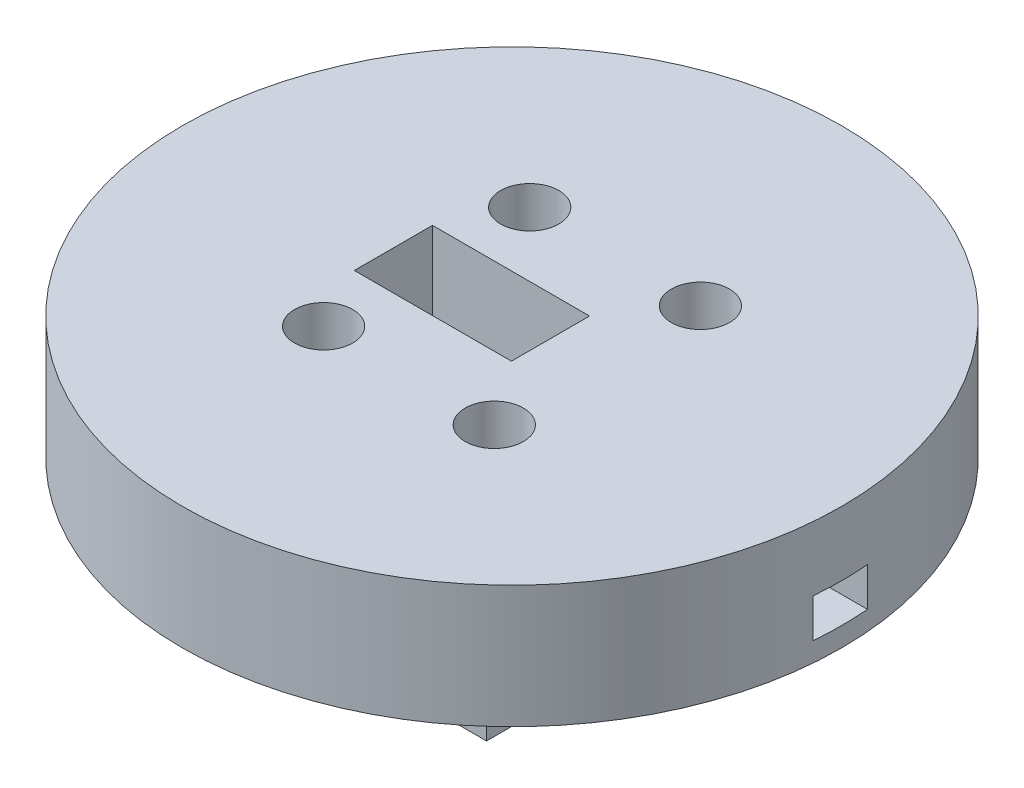
ISO-10303-21;
HEADER;
FILE_DESCRIPTION(('STEP AP214'),'2;1');
FILE_NAME('part.step','',(''),(''),'','','');
FILE_SCHEMA(('AUTOMOTIVE_DESIGN { 1 0 10303 214 1 1 1 1 }'));
ENDSEC;
DATA;
#1=APPLICATION_CONTEXT('core data for automotive mechanical design processes');
#2=APPLICATION_PROTOCOL_DEFINITION('international standard','automotive_design',2000,#1);
#3=PRODUCT_CONTEXT('',#1,'mechanical');
#4=PRODUCT('Part','Part','',(#3));
#5=PRODUCT_RELATED_PRODUCT_CATEGORY('part','',(#4));
#6=PRODUCT_DEFINITION_FORMATION('','',#4);
#7=PRODUCT_DEFINITION_CONTEXT('part definition',#1,'design');
#8=PRODUCT_DEFINITION('design','',#6,#7);
#9=PRODUCT_DEFINITION_SHAPE('','',#8);
#10=(LENGTH_UNIT() NAMED_UNIT(*) SI_UNIT(.MILLI.,.METRE.));
#11=(NAMED_UNIT(*) PLANE_ANGLE_UNIT() SI_UNIT($,.RADIAN.));
#12=(NAMED_UNIT(*) SI_UNIT($,.STERADIAN.) SOLID_ANGLE_UNIT());
#13=UNCERTAINTY_MEASURE_WITH_UNIT(LENGTH_MEASURE(1.E-05),#10,'distance_accuracy_value','');
#14=(GEOMETRIC_REPRESENTATION_CONTEXT(3) GLOBAL_UNCERTAINTY_ASSIGNED_CONTEXT((#13)) GLOBAL_UNIT_ASSIGNED_CONTEXT((#10,
#11,#12)) REPRESENTATION_CONTEXT('',''));
#15=CARTESIAN_POINT('',(0.,0.,0.));
#16=DIRECTION('',(0.,0.,1.));
#17=DIRECTION('',(1.,0.,0.));
#18=AXIS2_PLACEMENT_3D('',#15,#16,#17);
#19=CARTESIAN_POINT('',(-22.,-25.6066017177982,-26.57));
#20=DIRECTION('',(0.,1.,0.));
#21=DIRECTION('',(-1.,0.,0.));
#22=AXIS2_PLACEMENT_3D('',#19,#20,#21);
#23=CYLINDRICAL_SURFACE('',#22,3.74999999999999);
#24=CARTESIAN_POINT('',(-22.,-15.,-26.57));
#25=DIRECTION('',(0.,1.,0.));
#26=DIRECTION('',(-1.,0.,0.));
#27=AXIS2_PLACEMENT_3D('',#24,#25,#26);
#28=CIRCLE('',#27,3.74999999999999);
#29=CARTESIAN_POINT('',(-25.75,-15.,-26.57));
#30=VERTEX_POINT('',#29);
#31=EDGE_CURVE('E283',#30,#30,#28,.F.);
#32=ORIENTED_EDGE('',*,*,#31,.T.);
#33=EDGE_LOOP('',(#32));
#34=FACE_BOUND('',#33,.T.);
#35=CARTESIAN_POINT('',(-22.,-5.,-26.57));
#36=DIRECTION('',(0.,1.,0.));
#37=DIRECTION('',(-1.,0.,0.));
#38=AXIS2_PLACEMENT_3D('',#35,#36,#37);
#39=CIRCLE('',#38,3.74999999999999);
#40=CARTESIAN_POINT('',(-25.75,-5.,-26.57));
#41=VERTEX_POINT('',#40);
#42=EDGE_CURVE('E270',#41,#41,#39,.F.);
#43=ORIENTED_EDGE('',*,*,#42,.F.);
#44=EDGE_LOOP('',(#43));
#45=FACE_BOUND('',#44,.T.);
#46=ADVANCED_FACE('F32',(#34,#45),#23,.F.);
#47=CARTESIAN_POINT('',(22.,-25.6066017177982,26.57));
#48=DIRECTION('',(0.,1.,0.));
#49=DIRECTION('',(-1.,0.,0.));
#50=AXIS2_PLACEMENT_3D('',#47,#48,#49);
#51=CYLINDRICAL_SURFACE('',#50,3.75);
#52=CARTESIAN_POINT('',(22.,-15.,26.57));
#53=DIRECTION('',(0.,1.,0.));
#54=DIRECTION('',(-1.,0.,0.));
#55=AXIS2_PLACEMENT_3D('',#52,#53,#54);
#56=CIRCLE('',#55,3.75);
#57=CARTESIAN_POINT('',(18.25,-15.,26.57));
#58=VERTEX_POINT('',#57);
#59=EDGE_CURVE('E292',#58,#58,#56,.F.);
#60=ORIENTED_EDGE('',*,*,#59,.T.);
#61=EDGE_LOOP('',(#60));
#62=FACE_BOUND('',#61,.T.);
#63=CARTESIAN_POINT('',(22.,-5.,26.57));
#64=DIRECTION('',(0.,1.,0.));
#65=DIRECTION('',(-1.,0.,0.));
#66=AXIS2_PLACEMENT_3D('',#63,#64,#65);
#67=CIRCLE('',#66,3.75);
#68=CARTESIAN_POINT('',(18.25,-5.,26.57));
#69=VERTEX_POINT('',#68);
#70=EDGE_CURVE('E282',#69,#69,#67,.F.);
#71=ORIENTED_EDGE('',*,*,#70,.F.);
#72=EDGE_LOOP('',(#71));
#73=FACE_BOUND('',#72,.T.);
#74=ADVANCED_FACE('F508',(#62,#73),#51,.F.);
#75=CARTESIAN_POINT('',(30.,-15.,36.57));
#76=DIRECTION('',(0.,1.,0.));
#77=DIRECTION('',(-1.,0.,0.));
#78=AXIS2_PLACEMENT_3D('',#75,#76,#77);
#79=PLANE('',#78);
#80=ORIENTED_EDGE('',*,*,#59,.F.);
#81=EDGE_LOOP('',(#80));
#82=FACE_BOUND('',#81,.T.);
#83=DIRECTION('',(1.,0.,0.));
#84=VECTOR('',#83,1.);
#85=CARTESIAN_POINT('',(30.,-15.,36.57));
#86=LINE('',#85,#84);
#87=CARTESIAN_POINT('',(15.0942378864668,-15.,36.57));
#88=VERTEX_POINT('',#87);
#89=CARTESIAN_POINT('',(30.,-15.,36.57));
#90=VERTEX_POINT('',#89);
#91=EDGE_CURVE('E351',#88,#90,#86,.T.);
#92=ORIENTED_EDGE('',*,*,#91,.F.);
#93=DIRECTION('',(0.,0.,1.));
#94=VECTOR('',#93,1.);
#95=CARTESIAN_POINT('',(15.0942378864668,-15.,-73.3871114360294));
#96=LINE('',#95,#94);
#97=CARTESIAN_POINT('',(15.0942378864668,-15.,6.00000000000001));
#98=VERTEX_POINT('',#97);
#99=EDGE_CURVE('E321',#98,#88,#96,.T.);
#100=ORIENTED_EDGE('',*,*,#99,.F.);
#101=DIRECTION('',(1.,0.,0.));
#102=VECTOR('',#101,1.);
#103=CARTESIAN_POINT('',(-43.4164078649987,-15.,6.));
#104=LINE('',#103,#102);
#105=CARTESIAN_POINT('',(30.,-15.,6.));
#106=VERTEX_POINT('',#105);
#107=EDGE_CURVE('E342',#98,#106,#104,.T.);
#108=ORIENTED_EDGE('',*,*,#107,.T.);
#109=DIRECTION('',(0.,0.,-1.));
#110=VECTOR('',#109,1.);
#111=CARTESIAN_POINT('',(30.,-15.,36.57));
#112=LINE('',#111,#110);
#113=EDGE_CURVE('E367',#90,#106,#112,.T.);
#114=ORIENTED_EDGE('',*,*,#113,.F.);
#115=EDGE_LOOP('',(#92,#100,#108,#114));
#116=FACE_BOUND('',#115,.T.);
#117=ADVANCED_FACE('F463',(#82,#116),#79,.F.);
#118=CARTESIAN_POINT('',(22.,-15.,-26.57));
#119=DIRECTION('',(0.,1.,0.));
#120=DIRECTION('',(-1.,0.,0.));
#121=AXIS2_PLACEMENT_3D('',#118,#119,#120);
#122=CIRCLE('',#121,3.75);
#123=CARTESIAN_POINT('',(18.25,-15.,-26.57));
#124=VERTEX_POINT('',#123);
#125=EDGE_CURVE('E286',#124,#124,#122,.F.);
#126=ORIENTED_EDGE('',*,*,#125,.F.);
#127=EDGE_LOOP('',(#126));
#128=FACE_BOUND('',#127,.T.);
#129=DIRECTION('',(1.,0.,0.));
#130=VECTOR('',#129,1.);
#131=CARTESIAN_POINT('',(-43.4164078649987,-15.,-6.));
#132=LINE('',#131,#130);
#133=CARTESIAN_POINT('',(15.0942378864668,-15.,-6.00000000000001));
#134=VERTEX_POINT('',#133);
#135=CARTESIAN_POINT('',(30.,-15.,-6.));
#136=VERTEX_POINT('',#135);
#137=EDGE_CURVE('E345',#134,#136,#132,.T.);
#138=ORIENTED_EDGE('',*,*,#137,.F.);
#139=CARTESIAN_POINT('',(15.0942378864668,-15.,-36.57));
#140=VERTEX_POINT('',#139);
#141=EDGE_CURVE('E299',#140,#134,#96,.T.);
#142=ORIENTED_EDGE('',*,*,#141,.F.);
#143=DIRECTION('',(1.,0.,0.));
#144=VECTOR('',#143,1.);
#145=CARTESIAN_POINT('',(30.,-15.,-36.57));
#146=LINE('',#145,#144);
#147=CARTESIAN_POINT('',(30.,-15.,-36.57));
#148=VERTEX_POINT('',#147);
#149=EDGE_CURVE('E361',#140,#148,#146,.T.);
#150=ORIENTED_EDGE('',*,*,#149,.T.);
#151=EDGE_CURVE('E359',#136,#148,#112,.T.);
#152=ORIENTED_EDGE('',*,*,#151,.F.);
#153=EDGE_LOOP('',(#138,#142,#150,#152));
#154=FACE_BOUND('',#153,.T.);
#155=ADVANCED_FACE('F850',(#128,#154),#79,.F.);
#156=CARTESIAN_POINT('',(-43.4164078649987,-15.,0.));
#157=DIRECTION('',(1.,0.,0.));
#158=DIRECTION('',(0.,0.,-1.));
#159=AXIS2_PLACEMENT_3D('',#156,#157,#158);
#160=CYLINDRICAL_SURFACE('',#159,6.);
#161=CARTESIAN_POINT('',(15.0942378864668,-15.,0.));
#162=DIRECTION('',(0.965925826289069,0.258819045102518,0.));
#163=DIRECTION('',(0.258819045102518,-0.965925826289069,0.));
#164=AXIS2_PLACEMENT_3D('',#161,#162,#163);
#165=ELLIPSE('',#164,6.21165708246049,6.);
#166=EDGE_CURVE('E376',#134,#98,#165,.T.);
#167=ORIENTED_EDGE('',*,*,#166,.F.);
#168=ORIENTED_EDGE('',*,*,#137,.T.);
#169=CARTESIAN_POINT('',(30.,-15.,0.));
#170=DIRECTION('',(1.,0.,0.));
#171=DIRECTION('',(0.,0.,-1.));
#172=AXIS2_PLACEMENT_3D('',#169,#170,#171);
#173=CIRCLE('',#172,6.);
#174=EDGE_CURVE('E334',#106,#136,#173,.F.);
#175=ORIENTED_EDGE('',*,*,#174,.F.);
#176=ORIENTED_EDGE('',*,*,#107,.F.);
#177=EDGE_LOOP('',(#167,#168,#175,#176));
#178=FACE_BOUND('',#177,.T.);
#179=ADVANCED_FACE('F467',(#178),#160,.F.);
#180=CARTESIAN_POINT('',(-30.,-15.,36.57));
#181=DIRECTION('',(1.,0.,0.));
#182=DIRECTION('',(0.,0.,-1.));
#183=AXIS2_PLACEMENT_3D('',#180,#181,#182);
#184=PLANE('',#183);
#185=DIRECTION('',(0.,-1.,0.));
#186=VECTOR('',#185,1.);
#187=CARTESIAN_POINT('',(-30.,-15.,36.57));
#188=LINE('',#187,#186);
#189=CARTESIAN_POINT('',(-30.,7.,36.57));
#190=VERTEX_POINT('',#189);
#191=CARTESIAN_POINT('',(-30.,-15.,36.57));
#192=VERTEX_POINT('',#191);
#193=EDGE_CURVE('E349',#190,#192,#188,.T.);
#194=ORIENTED_EDGE('',*,*,#193,.F.);
#195=DIRECTION('',(0.,0.,1.));
#196=VECTOR('',#195,1.);
#197=CARTESIAN_POINT('',(-30.,6.99999999999999,-36.57));
#198=LINE('',#197,#196);
#199=CARTESIAN_POINT('',(-30.,7.,-36.57));
#200=VERTEX_POINT('',#199);
#201=EDGE_CURVE('E11',#190,#200,#198,.F.);
#202=ORIENTED_EDGE('',*,*,#201,.T.);
#203=DIRECTION('',(0.,-1.,0.));
#204=VECTOR('',#203,1.);
#205=CARTESIAN_POINT('',(-30.,-15.,-36.57));
#206=LINE('',#205,#204);
#207=CARTESIAN_POINT('',(-30.,-15.,-36.57));
#208=VERTEX_POINT('',#207);
#209=EDGE_CURVE('E338',#200,#208,#206,.T.);
#210=ORIENTED_EDGE('',*,*,#209,.T.);
#211=DIRECTION('',(0.,0.,-1.));
#212=VECTOR('',#211,1.);
#213=CARTESIAN_POINT('',(-30.,-15.,36.57));
#214=LINE('',#213,#212);
#215=CARTESIAN_POINT('',(-30.,-15.,-6.));
#216=VERTEX_POINT('',#215);
#217=EDGE_CURVE('E370',#216,#208,#214,.T.);
#218=ORIENTED_EDGE('',*,*,#217,.F.);
#219=CARTESIAN_POINT('',(-30.,-15.,0.));
#220=DIRECTION('',(1.,0.,0.));
#221=DIRECTION('',(0.,0.,-1.));
#222=AXIS2_PLACEMENT_3D('',#219,#220,#221);
#223=CIRCLE('',#222,6.);
#224=CARTESIAN_POINT('',(-30.,-15.,6.));
#225=VERTEX_POINT('',#224);
#226=EDGE_CURVE('E335',#216,#225,#223,.T.);
#227=ORIENTED_EDGE('',*,*,#226,.T.);
#228=EDGE_CURVE('E371',#192,#225,#214,.T.);
#229=ORIENTED_EDGE('',*,*,#228,.F.);
#230=EDGE_LOOP('',(#194,#202,#210,#218,#227,#229));
#231=FACE_BOUND('',#230,.T.);
#232=ADVANCED_FACE('F427',(#231),#184,.F.);
#233=CARTESIAN_POINT('',(-22.,-15.,26.57));
#234=DIRECTION('',(0.,1.,0.));
#235=DIRECTION('',(-1.,0.,0.));
#236=AXIS2_PLACEMENT_3D('',#233,#234,#235);
#237=CIRCLE('',#236,3.75);
#238=CARTESIAN_POINT('',(-25.75,-15.,26.57));
#239=VERTEX_POINT('',#238);
#240=EDGE_CURVE('E289',#239,#239,#237,.F.);
#241=ORIENTED_EDGE('',*,*,#240,.F.);
#242=EDGE_LOOP('',(#241));
#243=FACE_BOUND('',#242,.T.);
#244=CARTESIAN_POINT('',(-15.0942378864669,-15.,6.));
#245=VERTEX_POINT('',#244);
#246=EDGE_CURVE('E346',#225,#245,#104,.T.);
#247=ORIENTED_EDGE('',*,*,#246,.T.);
#248=DIRECTION('',(0.,0.,1.));
#249=VECTOR('',#248,1.);
#250=CARTESIAN_POINT('',(-15.0942378864669,-15.,-73.3871114360294));
#251=LINE('',#250,#249);
#252=CARTESIAN_POINT('',(-15.0942378864669,-15.,36.57));
#253=VERTEX_POINT('',#252);
#254=EDGE_CURVE('E325',#245,#253,#251,.T.);
#255=ORIENTED_EDGE('',*,*,#254,.T.);
#256=EDGE_CURVE('E353',#192,#253,#86,.T.);
#257=ORIENTED_EDGE('',*,*,#256,.F.);
#258=ORIENTED_EDGE('',*,*,#228,.T.);
#259=EDGE_LOOP('',(#247,#255,#257,#258));
#260=FACE_BOUND('',#259,.T.);
#261=ADVANCED_FACE('F431',(#243,#260),#79,.F.);
#262=ORIENTED_EDGE('',*,*,#31,.F.);
#263=EDGE_LOOP('',(#262));
#264=FACE_BOUND('',#263,.T.);
#265=CARTESIAN_POINT('',(-15.0942378864669,-15.,-36.57));
#266=VERTEX_POINT('',#265);
#267=EDGE_CURVE('E362',#208,#266,#146,.T.);
#268=ORIENTED_EDGE('',*,*,#267,.T.);
#269=CARTESIAN_POINT('',(-15.0942378864669,-15.,-6.00000000000003));
#270=VERTEX_POINT('',#269);
#271=EDGE_CURVE('E322',#266,#270,#251,.T.);
#272=ORIENTED_EDGE('',*,*,#271,.T.);
#273=EDGE_CURVE('E339',#216,#270,#132,.T.);
#274=ORIENTED_EDGE('',*,*,#273,.F.);
#275=ORIENTED_EDGE('',*,*,#217,.T.);
#276=EDGE_LOOP('',(#268,#272,#274,#275));
#277=FACE_BOUND('',#276,.T.);
#278=ADVANCED_FACE('F549',(#264,#277),#79,.F.);
#279=CARTESIAN_POINT('',(30.,-15.,36.57));
#280=DIRECTION('',(-1.,0.,0.));
#281=DIRECTION('',(0.,0.,1.));
#282=AXIS2_PLACEMENT_3D('',#279,#280,#281);
#283=PLANE('',#282);
#284=DIRECTION('',(0.,1.,0.));
#285=VECTOR('',#284,1.);
#286=CARTESIAN_POINT('',(30.,-15.,-36.57));
#287=LINE('',#286,#285);
#288=CARTESIAN_POINT('',(30.,7.,-36.57));
#289=VERTEX_POINT('',#288);
#290=EDGE_CURVE('E352',#148,#289,#287,.T.);
#291=ORIENTED_EDGE('',*,*,#290,.T.);
#292=DIRECTION('',(0.,0.,1.));
#293=VECTOR('',#292,1.);
#294=CARTESIAN_POINT('',(30.,7.,36.57));
#295=LINE('',#294,#293);
#296=CARTESIAN_POINT('',(30.,7.,36.57));
#297=VERTEX_POINT('',#296);
#298=EDGE_CURVE('E398',#289,#297,#295,.T.);
#299=ORIENTED_EDGE('',*,*,#298,.T.);
#300=DIRECTION('',(0.,1.,0.));
#301=VECTOR('',#300,1.);
#302=CARTESIAN_POINT('',(30.,-15.,36.57));
#303=LINE('',#302,#301);
#304=EDGE_CURVE('E356',#90,#297,#303,.T.);
#305=ORIENTED_EDGE('',*,*,#304,.F.);
#306=ORIENTED_EDGE('',*,*,#113,.T.);
#307=ORIENTED_EDGE('',*,*,#174,.T.);
#308=ORIENTED_EDGE('',*,*,#151,.T.);
#309=EDGE_LOOP('',(#291,#299,#305,#306,#307,#308));
#310=FACE_BOUND('',#309,.T.);
#311=ADVANCED_FACE('F472',(#310),#283,.F.);
#312=CARTESIAN_POINT('',(0.,0.,36.57));
#313=DIRECTION('',(0.,0.,1.));
#314=DIRECTION('',(1.,0.,0.));
#315=AXIS2_PLACEMENT_3D('',#312,#313,#314);
#316=PLANE('',#315);
#317=ORIENTED_EDGE('',*,*,#304,.T.);
#318=DIRECTION('',(-1.,0.,0.));
#319=VECTOR('',#318,1.);
#320=CARTESIAN_POINT('',(0.,7.,36.57));
#321=LINE('',#320,#319);
#322=EDGE_CURVE('E41',#297,#190,#321,.T.);
#323=ORIENTED_EDGE('',*,*,#322,.T.);
#324=ORIENTED_EDGE('',*,*,#193,.T.);
#325=ORIENTED_EDGE('',*,*,#256,.T.);
#326=DIRECTION('',(-0.258819045102525,-0.965925826289067,0.));
#327=VECTOR('',#326,1.);
#328=CARTESIAN_POINT('',(-11.075,0.,36.57));
#329=LINE('',#328,#327);
#330=CARTESIAN_POINT('',(-11.075,0.,36.57));
#331=VERTEX_POINT('',#330);
#332=EDGE_CURVE('E317',#331,#253,#329,.T.);
#333=ORIENTED_EDGE('',*,*,#332,.F.);
#334=DIRECTION('',(-1.,0.,0.));
#335=VECTOR('',#334,1.);
#336=CARTESIAN_POINT('',(-6.075,0.,36.57));
#337=LINE('',#336,#335);
#338=CARTESIAN_POINT('',(-6.075,0.,36.57));
#339=VERTEX_POINT('',#338);
#340=EDGE_CURVE('E314',#339,#331,#337,.T.);
#341=ORIENTED_EDGE('',*,*,#340,.F.);
#342=CARTESIAN_POINT('',(0.,0.,36.57));
#343=DIRECTION('',(0.,0.,1.));
#344=DIRECTION('',(1.,0.,0.));
#345=AXIS2_PLACEMENT_3D('',#342,#343,#344);
#346=CIRCLE('',#345,6.075);
#347=CARTESIAN_POINT('',(6.075,0.,36.57));
#348=VERTEX_POINT('',#347);
#349=EDGE_CURVE('E311',#348,#339,#346,.T.);
#350=ORIENTED_EDGE('',*,*,#349,.F.);
#351=DIRECTION('',(-1.,0.,0.));
#352=VECTOR('',#351,1.);
#353=CARTESIAN_POINT('',(6.075,0.,36.57));
#354=LINE('',#353,#352);
#355=CARTESIAN_POINT('',(11.075,0.,36.57));
#356=VERTEX_POINT('',#355);
#357=EDGE_CURVE('E308',#356,#348,#354,.T.);
#358=ORIENTED_EDGE('',*,*,#357,.F.);
#359=DIRECTION('',(-0.258819045102518,0.965925826289069,0.));
#360=VECTOR('',#359,1.);
#361=CARTESIAN_POINT('',(11.075,0.,36.57));
#362=LINE('',#361,#360);
#363=EDGE_CURVE('E295',#88,#356,#362,.T.);
#364=ORIENTED_EDGE('',*,*,#363,.F.);
#365=ORIENTED_EDGE('',*,*,#91,.T.);
#366=EDGE_LOOP('',(#317,#323,#324,#325,#333,#341,#350,#358,#364,#365));
#367=FACE_BOUND('',#366,.T.);
#368=ADVANCED_FACE('F422',(#367),#316,.T.);
#369=CARTESIAN_POINT('',(0.,0.,-36.57));
#370=DIRECTION('',(0.,0.,1.));
#371=DIRECTION('',(1.,0.,0.));
#372=AXIS2_PLACEMENT_3D('',#369,#370,#371);
#373=PLANE('',#372);
#374=ORIENTED_EDGE('',*,*,#209,.F.);
#375=DIRECTION('',(-1.,0.,0.));
#376=VECTOR('',#375,1.);
#377=CARTESIAN_POINT('',(30.,7.,-36.57));
#378=LINE('',#377,#376);
#379=EDGE_CURVE('E395',#200,#289,#378,.F.);
#380=ORIENTED_EDGE('',*,*,#379,.T.);
#381=ORIENTED_EDGE('',*,*,#290,.F.);
#382=ORIENTED_EDGE('',*,*,#149,.F.);
#383=DIRECTION('',(0.258819045102518,-0.965925826289069,0.));
#384=VECTOR('',#383,1.);
#385=CARTESIAN_POINT('',(11.075,0.,-36.57));
#386=LINE('',#385,#384);
#387=CARTESIAN_POINT('',(11.075,0.,-36.57));
#388=VERTEX_POINT('',#387);
#389=EDGE_CURVE('E303',#388,#140,#386,.T.);
#390=ORIENTED_EDGE('',*,*,#389,.F.);
#391=DIRECTION('',(1.,0.,0.));
#392=VECTOR('',#391,1.);
#393=CARTESIAN_POINT('',(6.075,0.,-36.57));
#394=LINE('',#393,#392);
#395=CARTESIAN_POINT('',(6.075,0.,-36.57));
#396=VERTEX_POINT('',#395);
#397=EDGE_CURVE('E305',#396,#388,#394,.T.);
#398=ORIENTED_EDGE('',*,*,#397,.F.);
#399=CARTESIAN_POINT('',(0.,0.,-36.57));
#400=DIRECTION('',(0.,0.,1.));
#401=DIRECTION('',(1.,0.,0.));
#402=AXIS2_PLACEMENT_3D('',#399,#400,#401);
#403=CIRCLE('',#402,6.075);
#404=CARTESIAN_POINT('',(-6.075,0.,-36.57));
#405=VERTEX_POINT('',#404);
#406=EDGE_CURVE('E296',#405,#396,#403,.F.);
#407=ORIENTED_EDGE('',*,*,#406,.F.);
#408=DIRECTION('',(1.,0.,0.));
#409=VECTOR('',#408,1.);
#410=CARTESIAN_POINT('',(-6.075,0.,-36.57));
#411=LINE('',#410,#409);
#412=CARTESIAN_POINT('',(-11.075,0.,-36.57));
#413=VERTEX_POINT('',#412);
#414=EDGE_CURVE('E298',#413,#405,#411,.T.);
#415=ORIENTED_EDGE('',*,*,#414,.F.);
#416=DIRECTION('',(0.258819045102525,0.965925826289067,0.));
#417=VECTOR('',#416,1.);
#418=CARTESIAN_POINT('',(-11.075,0.,-36.57));
#419=LINE('',#418,#417);
#420=EDGE_CURVE('E301',#266,#413,#419,.T.);
#421=ORIENTED_EDGE('',*,*,#420,.F.);
#422=ORIENTED_EDGE('',*,*,#267,.F.);
#423=EDGE_LOOP('',(#374,#380,#381,#382,#390,#398,#407,#415,#421,#422));
#424=FACE_BOUND('',#423,.T.);
#425=ADVANCED_FACE('F476',(#424),#373,.F.);
#426=CARTESIAN_POINT('',(-15.0942378864669,-15.,0.));
#427=DIRECTION('',(-0.965925826289067,0.258819045102525,0.));
#428=DIRECTION('',(0.258819045102525,0.965925826289067,0.));
#429=AXIS2_PLACEMENT_3D('',#426,#427,#428);
#430=ELLIPSE('',#429,6.2116570824605,6.);
#431=EDGE_CURVE('E374',#245,#270,#430,.T.);
#432=ORIENTED_EDGE('',*,*,#431,.F.);
#433=ORIENTED_EDGE('',*,*,#246,.F.);
#434=ORIENTED_EDGE('',*,*,#226,.F.);
#435=ORIENTED_EDGE('',*,*,#273,.T.);
#436=EDGE_LOOP('',(#432,#433,#434,#435));
#437=FACE_BOUND('',#436,.T.);
#438=ADVANCED_FACE('F539',(#437),#160,.F.);
#439=CARTESIAN_POINT('',(11.075,0.,-73.3871114360294));
#440=DIRECTION('',(0.965925826289069,0.258819045102518,0.));
#441=DIRECTION('',(-0.258819045102518,0.965925826289069,0.));
#442=AXIS2_PLACEMENT_3D('',#439,#440,#441);
#443=PLANE('',#442);
#444=ORIENTED_EDGE('',*,*,#166,.T.);
#445=ORIENTED_EDGE('',*,*,#99,.T.);
#446=ORIENTED_EDGE('',*,*,#363,.T.);
#447=DIRECTION('',(0.,0.,1.));
#448=VECTOR('',#447,1.);
#449=CARTESIAN_POINT('',(11.075,0.,-73.3871114360294));
#450=LINE('',#449,#448);
#451=EDGE_CURVE('E319',#388,#356,#450,.T.);
#452=ORIENTED_EDGE('',*,*,#451,.F.);
#453=ORIENTED_EDGE('',*,*,#389,.T.);
#454=ORIENTED_EDGE('',*,*,#141,.T.);
#455=EDGE_LOOP('',(#444,#445,#446,#452,#453,#454));
#456=FACE_BOUND('',#455,.T.);
#457=ADVANCED_FACE('F458',(#456),#443,.F.);
#458=CARTESIAN_POINT('',(-11.075,0.,-73.3871114360294));
#459=DIRECTION('',(-0.965925826289067,0.258819045102525,0.));
#460=DIRECTION('',(-0.258819045102525,-0.965925826289067,0.));
#461=AXIS2_PLACEMENT_3D('',#458,#459,#460);
#462=PLANE('',#461);
#463=ORIENTED_EDGE('',*,*,#431,.T.);
#464=ORIENTED_EDGE('',*,*,#271,.F.);
#465=ORIENTED_EDGE('',*,*,#420,.T.);
#466=DIRECTION('',(0.,0.,1.));
#467=VECTOR('',#466,1.);
#468=CARTESIAN_POINT('',(-11.075,0.,-73.3871114360294));
#469=LINE('',#468,#467);
#470=EDGE_CURVE('E326',#413,#331,#469,.T.);
#471=ORIENTED_EDGE('',*,*,#470,.T.);
#472=ORIENTED_EDGE('',*,*,#332,.T.);
#473=ORIENTED_EDGE('',*,*,#254,.F.);
#474=EDGE_LOOP('',(#463,#464,#465,#471,#472,#473));
#475=FACE_BOUND('',#474,.T.);
#476=ADVANCED_FACE('F437',(#475),#462,.F.);
#477=CARTESIAN_POINT('',(-6.075,0.,-73.3871114360294));
#478=DIRECTION('',(0.,1.,0.));
#479=DIRECTION('',(-1.,0.,0.));
#480=AXIS2_PLACEMENT_3D('',#477,#478,#479);
#481=PLANE('',#480);
#482=ORIENTED_EDGE('',*,*,#414,.T.);
#483=DIRECTION('',(0.,0.,1.));
#484=VECTOR('',#483,1.);
#485=CARTESIAN_POINT('',(-6.075,0.,-73.3871114360294));
#486=LINE('',#485,#484);
#487=EDGE_CURVE('E328',#405,#339,#486,.T.);
#488=ORIENTED_EDGE('',*,*,#487,.T.);
#489=ORIENTED_EDGE('',*,*,#340,.T.);
#490=ORIENTED_EDGE('',*,*,#470,.F.);
#491=EDGE_LOOP('',(#482,#488,#489,#490));
#492=FACE_BOUND('',#491,.T.);
#493=ADVANCED_FACE('F443',(#492),#481,.F.);
#494=CARTESIAN_POINT('',(0.,0.,-73.3871114360294));
#495=DIRECTION('',(0.,0.,1.));
#496=DIRECTION('',(1.,0.,0.));
#497=AXIS2_PLACEMENT_3D('',#494,#495,#496);
#498=CYLINDRICAL_SURFACE('',#497,6.075);
#499=ORIENTED_EDGE('',*,*,#406,.T.);
#500=DIRECTION('',(0.,0.,1.));
#501=VECTOR('',#500,1.);
#502=CARTESIAN_POINT('',(6.075,0.,-73.3871114360294));
#503=LINE('',#502,#501);
#504=EDGE_CURVE('E330',#396,#348,#503,.T.);
#505=ORIENTED_EDGE('',*,*,#504,.T.);
#506=ORIENTED_EDGE('',*,*,#349,.T.);
#507=ORIENTED_EDGE('',*,*,#487,.F.);
#508=EDGE_LOOP('',(#499,#505,#506,#507));
#509=FACE_BOUND('',#508,.T.);
#510=ADVANCED_FACE('F447',(#509),#498,.F.);
#511=CARTESIAN_POINT('',(6.075,0.,-73.3871114360294));
#512=DIRECTION('',(0.,1.,0.));
#513=DIRECTION('',(0.,0.,1.));
#514=AXIS2_PLACEMENT_3D('',#511,#512,#513);
#515=PLANE('',#514);
#516=ORIENTED_EDGE('',*,*,#397,.T.);
#517=ORIENTED_EDGE('',*,*,#451,.T.);
#518=ORIENTED_EDGE('',*,*,#357,.T.);
#519=ORIENTED_EDGE('',*,*,#504,.F.);
#520=EDGE_LOOP('',(#516,#517,#518,#519));
#521=FACE_BOUND('',#520,.T.);
#522=ADVANCED_FACE('F453',(#521),#515,.F.);
#523=CARTESIAN_POINT('',(-22.,-25.6066017177982,26.57));
#524=DIRECTION('',(0.,1.,0.));
#525=DIRECTION('',(-1.,0.,0.));
#526=AXIS2_PLACEMENT_3D('',#523,#524,#525);
#527=CYLINDRICAL_SURFACE('',#526,3.75);
#528=CARTESIAN_POINT('',(-22.,-5.,26.57));
#529=DIRECTION('',(0.,-1.,0.));
#530=DIRECTION('',(1.,0.,0.));
#531=AXIS2_PLACEMENT_3D('',#528,#529,#530);
#532=CIRCLE('',#531,3.75);
#533=CARTESIAN_POINT('',(-18.25,-5.,26.57));
#534=VERTEX_POINT('',#533);
#535=EDGE_CURVE('E278',#534,#534,#532,.F.);
#536=ORIENTED_EDGE('',*,*,#535,.T.);
#537=EDGE_LOOP('',(#536));
#538=FACE_BOUND('',#537,.T.);
#539=ORIENTED_EDGE('',*,*,#240,.T.);
#540=EDGE_LOOP('',(#539));
#541=FACE_BOUND('',#540,.T.);
#542=ADVANCED_FACE('F524',(#538,#541),#527,.F.);
#543=CARTESIAN_POINT('',(22.,-25.6066017177982,-26.57));
#544=DIRECTION('',(0.,1.,0.));
#545=DIRECTION('',(-1.,0.,0.));
#546=AXIS2_PLACEMENT_3D('',#543,#544,#545);
#547=CYLINDRICAL_SURFACE('',#546,3.75);
#548=CARTESIAN_POINT('',(22.,-5.,-26.57));
#549=DIRECTION('',(0.,-1.,0.));
#550=DIRECTION('',(1.,0.,0.));
#551=AXIS2_PLACEMENT_3D('',#548,#549,#550);
#552=CIRCLE('',#551,3.75);
#553=CARTESIAN_POINT('',(25.75,-5.,-26.57));
#554=VERTEX_POINT('',#553);
#555=EDGE_CURVE('E274',#554,#554,#552,.F.);
#556=ORIENTED_EDGE('',*,*,#555,.T.);
#557=EDGE_LOOP('',(#556));
#558=FACE_BOUND('',#557,.T.);
#559=ORIENTED_EDGE('',*,*,#125,.T.);
#560=EDGE_LOOP('',(#559));
#561=FACE_BOUND('',#560,.T.);
#562=ADVANCED_FACE('F521',(#558,#561),#547,.F.);
#563=CARTESIAN_POINT('',(22.,-5.,26.57));
#564=DIRECTION('',(0.,1.,0.));
#565=DIRECTION('',(-1.,0.,0.));
#566=AXIS2_PLACEMENT_3D('',#563,#564,#565);
#567=CYLINDRICAL_SURFACE('',#566,7.5);
#568=CARTESIAN_POINT('',(22.,-5.,26.57));
#569=DIRECTION('',(0.,1.,0.));
#570=DIRECTION('',(-1.,0.,0.));
#571=AXIS2_PLACEMENT_3D('',#568,#569,#570);
#572=CIRCLE('',#571,7.5);
#573=CARTESIAN_POINT('',(14.5,-5.,26.57));
#574=VERTEX_POINT('',#573);
#575=EDGE_CURVE('E279',#574,#574,#572,.T.);
#576=ORIENTED_EDGE('',*,*,#575,.F.);
#577=EDGE_LOOP('',(#576));
#578=FACE_BOUND('',#577,.T.);
#579=CARTESIAN_POINT('',(22.,46.6,26.57));
#580=DIRECTION('',(0.,1.,0.));
#581=DIRECTION('',(-1.,0.,0.));
#582=AXIS2_PLACEMENT_3D('',#579,#580,#581);
#583=CIRCLE('',#582,7.5);
#584=CARTESIAN_POINT('',(14.5,46.6,26.57));
#585=VERTEX_POINT('',#584);
#586=EDGE_CURVE('E258',#585,#585,#583,.F.);
#587=ORIENTED_EDGE('',*,*,#586,.F.);
#588=EDGE_LOOP('',(#587));
#589=FACE_BOUND('',#588,.T.);
#590=ADVANCED_FACE('F519',(#578,#589),#567,.F.);
#591=CARTESIAN_POINT('',(22.,-5.,26.57));
#592=DIRECTION('',(0.,1.,0.));
#593=DIRECTION('',(-1.,0.,0.));
#594=AXIS2_PLACEMENT_3D('',#591,#592,#593);
#595=PLANE('',#594);
#596=ORIENTED_EDGE('',*,*,#575,.T.);
#597=EDGE_LOOP('',(#596));
#598=FACE_BOUND('',#597,.T.);
#599=ORIENTED_EDGE('',*,*,#70,.T.);
#600=EDGE_LOOP('',(#599));
#601=FACE_BOUND('',#600,.T.);
#602=ADVANCED_FACE('F651',(#598,#601),#595,.T.);
#603=CARTESIAN_POINT('',(-22.,-5.,26.57));
#604=DIRECTION('',(0.,1.,0.));
#605=DIRECTION('',(-1.,0.,0.));
#606=AXIS2_PLACEMENT_3D('',#603,#604,#605);
#607=CYLINDRICAL_SURFACE('',#606,7.5);
#608=CARTESIAN_POINT('',(-22.,-5.,26.57));
#609=DIRECTION('',(0.,1.,0.));
#610=DIRECTION('',(1.,0.,0.));
#611=AXIS2_PLACEMENT_3D('',#608,#609,#610);
#612=CIRCLE('',#611,7.5);
#613=CARTESIAN_POINT('',(-14.5,-5.,26.57));
#614=VERTEX_POINT('',#613);
#615=EDGE_CURVE('E275',#614,#614,#612,.T.);
#616=ORIENTED_EDGE('',*,*,#615,.F.);
#617=EDGE_LOOP('',(#616));
#618=FACE_BOUND('',#617,.T.);
#619=CARTESIAN_POINT('',(-22.,46.6,26.57));
#620=DIRECTION('',(0.,1.,0.));
#621=DIRECTION('',(-1.,0.,0.));
#622=AXIS2_PLACEMENT_3D('',#619,#620,#621);
#623=CIRCLE('',#622,7.5);
#624=CARTESIAN_POINT('',(-29.5,46.6,26.57));
#625=VERTEX_POINT('',#624);
#626=EDGE_CURVE('E243',#625,#625,#623,.F.);
#627=ORIENTED_EDGE('',*,*,#626,.F.);
#628=EDGE_LOOP('',(#627));
#629=FACE_BOUND('',#628,.T.);
#630=ADVANCED_FACE('F657',(#618,#629),#607,.F.);
#631=CARTESIAN_POINT('',(-22.,-5.,26.57));
#632=DIRECTION('',(0.,-1.,0.));
#633=DIRECTION('',(1.,0.,0.));
#634=AXIS2_PLACEMENT_3D('',#631,#632,#633);
#635=PLANE('',#634);
#636=ORIENTED_EDGE('',*,*,#615,.T.);
#637=EDGE_LOOP('',(#636));
#638=FACE_BOUND('',#637,.T.);
#639=ORIENTED_EDGE('',*,*,#535,.F.);
#640=EDGE_LOOP('',(#639));
#641=FACE_BOUND('',#640,.T.);
#642=ADVANCED_FACE('F666',(#638,#641),#635,.F.);
#643=CARTESIAN_POINT('',(22.,-5.,-26.57));
#644=DIRECTION('',(0.,1.,0.));
#645=DIRECTION('',(-1.,0.,0.));
#646=AXIS2_PLACEMENT_3D('',#643,#644,#645);
#647=CYLINDRICAL_SURFACE('',#646,7.5);
#648=CARTESIAN_POINT('',(22.,-5.,-26.57));
#649=DIRECTION('',(0.,1.,0.));
#650=DIRECTION('',(1.,0.,0.));
#651=AXIS2_PLACEMENT_3D('',#648,#649,#650);
#652=CIRCLE('',#651,7.5);
#653=CARTESIAN_POINT('',(29.5,-5.,-26.57));
#654=VERTEX_POINT('',#653);
#655=EDGE_CURVE('E271',#654,#654,#652,.T.);
#656=ORIENTED_EDGE('',*,*,#655,.F.);
#657=EDGE_LOOP('',(#656));
#658=FACE_BOUND('',#657,.T.);
#659=CARTESIAN_POINT('',(21.9999999999999,46.6,-26.57));
#660=DIRECTION('',(0.,1.,0.));
#661=DIRECTION('',(-1.,0.,0.));
#662=AXIS2_PLACEMENT_3D('',#659,#660,#661);
#663=CIRCLE('',#662,7.5);
#664=CARTESIAN_POINT('',(14.4999999999999,46.6,-26.57));
#665=VERTEX_POINT('',#664);
#666=EDGE_CURVE('E255',#665,#665,#663,.F.);
#667=ORIENTED_EDGE('',*,*,#666,.F.);
#668=EDGE_LOOP('',(#667));
#669=FACE_BOUND('',#668,.T.);
#670=ADVANCED_FACE('F671',(#658,#669),#647,.F.);
#671=CARTESIAN_POINT('',(22.,-5.,-26.57));
#672=DIRECTION('',(0.,-1.,0.));
#673=DIRECTION('',(1.,0.,0.));
#674=AXIS2_PLACEMENT_3D('',#671,#672,#673);
#675=PLANE('',#674);
#676=ORIENTED_EDGE('',*,*,#655,.T.);
#677=EDGE_LOOP('',(#676));
#678=FACE_BOUND('',#677,.T.);
#679=ORIENTED_EDGE('',*,*,#555,.F.);
#680=EDGE_LOOP('',(#679));
#681=FACE_BOUND('',#680,.T.);
#682=ADVANCED_FACE('F675',(#678,#681),#675,.F.);
#683=CARTESIAN_POINT('',(-22.,-5.,-26.57));
#684=DIRECTION('',(0.,1.,0.));
#685=DIRECTION('',(-1.,0.,0.));
#686=AXIS2_PLACEMENT_3D('',#683,#684,#685);
#687=CYLINDRICAL_SURFACE('',#686,7.5);
#688=CARTESIAN_POINT('',(-22.,-5.,-26.57));
#689=DIRECTION('',(0.,1.,0.));
#690=DIRECTION('',(-1.,0.,0.));
#691=AXIS2_PLACEMENT_3D('',#688,#689,#690);
#692=CIRCLE('',#691,7.5);
#693=CARTESIAN_POINT('',(-29.5,-5.,-26.57));
#694=VERTEX_POINT('',#693);
#695=EDGE_CURVE('E265',#694,#694,#692,.T.);
#696=ORIENTED_EDGE('',*,*,#695,.F.);
#697=EDGE_LOOP('',(#696));
#698=FACE_BOUND('',#697,.T.);
#699=CARTESIAN_POINT('',(-22.,46.6,-26.57));
#700=DIRECTION('',(0.,1.,0.));
#701=DIRECTION('',(-1.,0.,0.));
#702=AXIS2_PLACEMENT_3D('',#699,#700,#701);
#703=CIRCLE('',#702,7.5);
#704=CARTESIAN_POINT('',(-29.5,46.6,-26.57));
#705=VERTEX_POINT('',#704);
#706=EDGE_CURVE('E252',#705,#705,#703,.F.);
#707=ORIENTED_EDGE('',*,*,#706,.F.);
#708=EDGE_LOOP('',(#707));
#709=FACE_BOUND('',#708,.T.);
#710=ADVANCED_FACE('F679',(#698,#709),#687,.F.);
#711=CARTESIAN_POINT('',(-22.,-5.,-26.57));
#712=DIRECTION('',(0.,1.,0.));
#713=DIRECTION('',(-1.,0.,0.));
#714=AXIS2_PLACEMENT_3D('',#711,#712,#713);
#715=PLANE('',#714);
#716=ORIENTED_EDGE('',*,*,#695,.T.);
#717=EDGE_LOOP('',(#716));
#718=FACE_BOUND('',#717,.T.);
#719=ORIENTED_EDGE('',*,*,#42,.T.);
#720=EDGE_LOOP('',(#719));
#721=FACE_BOUND('',#720,.T.);
#722=ADVANCED_FACE('F489',(#718,#721),#715,.T.);
#723=CARTESIAN_POINT('',(0.,15.,0.));
#724=DIRECTION('',(0.,1.,0.));
#725=DIRECTION('',(-1.,0.,0.));
#726=AXIS2_PLACEMENT_3D('',#723,#724,#725);
#727=PLANE('',#726);
#728=DIRECTION('',(0.,0.,1.));
#729=VECTOR('',#728,1.);
#730=CARTESIAN_POINT('',(38.,15.,-36.57));
#731=LINE('',#730,#729);
#732=CARTESIAN_POINT('',(38.,15.,44.57));
#733=VERTEX_POINT('',#732);
#734=CARTESIAN_POINT('',(38.,15.,-44.57));
#735=VERTEX_POINT('',#734);
#736=EDGE_CURVE('E390',#733,#735,#731,.F.);
#737=ORIENTED_EDGE('',*,*,#736,.T.);
#738=DIRECTION('',(-1.,0.,0.));
#739=VECTOR('',#738,1.);
#740=CARTESIAN_POINT('',(-30.,15.,-44.57));
#741=LINE('',#740,#739);
#742=CARTESIAN_POINT('',(-38.,15.,-44.57));
#743=VERTEX_POINT('',#742);
#744=EDGE_CURVE('E392',#735,#743,#741,.T.);
#745=ORIENTED_EDGE('',*,*,#744,.T.);
#746=DIRECTION('',(0.,0.,1.));
#747=VECTOR('',#746,1.);
#748=CARTESIAN_POINT('',(-38.,15.,36.57));
#749=LINE('',#748,#747);
#750=CARTESIAN_POINT('',(-38.,15.,44.57));
#751=VERTEX_POINT('',#750);
#752=EDGE_CURVE('E378',#743,#751,#749,.T.);
#753=ORIENTED_EDGE('',*,*,#752,.T.);
#754=DIRECTION('',(-1.,0.,0.));
#755=VECTOR('',#754,1.);
#756=CARTESIAN_POINT('',(0.,15.,44.57));
#757=LINE('',#756,#755);
#758=EDGE_CURVE('E388',#751,#733,#757,.F.);
#759=ORIENTED_EDGE('',*,*,#758,.T.);
#760=EDGE_LOOP('',(#737,#745,#753,#759));
#761=FACE_BOUND('',#760,.T.);
#762=CARTESIAN_POINT('',(0.,15.,0.));
#763=DIRECTION('',(0.,1.,0.));
#764=DIRECTION('',(-1.,0.,0.));
#765=AXIS2_PLACEMENT_3D('',#762,#763,#764);
#766=CIRCLE('',#765,85.);
#767=CARTESIAN_POINT('',(-85.,15.,0.));
#768=VERTEX_POINT('',#767);
#769=EDGE_CURVE('E261',#768,#768,#766,.T.);
#770=ORIENTED_EDGE('',*,*,#769,.F.);
#771=EDGE_LOOP('',(#770));
#772=FACE_BOUND('',#771,.T.);
#773=ADVANCED_FACE('F485',(#761,#772),#727,.F.);
#774=CARTESIAN_POINT('',(0.,46.6,0.));
#775=DIRECTION('',(0.,-1.,0.));
#776=DIRECTION('',(1.,0.,0.));
#777=AXIS2_PLACEMENT_3D('',#774,#775,#776);
#778=CYLINDRICAL_SURFACE('',#777,85.);
#779=DIRECTION('',(0.,-1.,0.));
#780=VECTOR('',#779,1.);
#781=CARTESIAN_POINT('',(84.7174384350707,46.6,-6.92500000000001));
#782=LINE('',#781,#780);
#783=CARTESIAN_POINT('',(84.7174384350707,30.,-6.92500000000001));
#784=VERTEX_POINT('',#783);
#785=CARTESIAN_POINT('',(84.7174384350707,20.,-6.92500000000001));
#786=VERTEX_POINT('',#785);
#787=EDGE_CURVE('E629',#784,#786,#782,.T.);
#788=ORIENTED_EDGE('',*,*,#787,.T.);
#789=CARTESIAN_POINT('',(0.,20.,0.));
#790=DIRECTION('',(0.,-1.,0.));
#791=DIRECTION('',(1.,0.,0.));
#792=AXIS2_PLACEMENT_3D('',#789,#790,#791);
#793=CIRCLE('',#792,85.);
#794=CARTESIAN_POINT('',(84.7050433858575,20.,7.07499999999999));
#795=VERTEX_POINT('',#794);
#796=EDGE_CURVE('E225',#786,#795,#793,.T.);
#797=ORIENTED_EDGE('',*,*,#796,.T.);
#798=DIRECTION('',(0.,-1.,0.));
#799=VECTOR('',#798,1.);
#800=CARTESIAN_POINT('',(84.7050433858575,46.6,7.07499999999999));
#801=LINE('',#800,#799);
#802=CARTESIAN_POINT('',(84.7050433858575,30.,7.07499999999999));
#803=VERTEX_POINT('',#802);
#804=EDGE_CURVE('E199',#795,#803,#801,.F.);
#805=ORIENTED_EDGE('',*,*,#804,.T.);
#806=CARTESIAN_POINT('',(0.,30.,0.));
#807=DIRECTION('',(0.,1.,0.));
#808=DIRECTION('',(-1.,0.,0.));
#809=AXIS2_PLACEMENT_3D('',#806,#807,#808);
#810=CIRCLE('',#809,85.);
#811=EDGE_CURVE('E621',#803,#784,#810,.T.);
#812=ORIENTED_EDGE('',*,*,#811,.T.);
#813=EDGE_LOOP('',(#788,#797,#805,#812));
#814=FACE_BOUND('',#813,.T.);
#815=CARTESIAN_POINT('',(0.,46.6,0.));
#816=DIRECTION('',(0.,1.,0.));
#817=DIRECTION('',(-1.,0.,0.));
#818=AXIS2_PLACEMENT_3D('',#815,#816,#817);
#819=CIRCLE('',#818,85.);
#820=CARTESIAN_POINT('',(-85.,46.6,0.));
#821=VERTEX_POINT('',#820);
#822=EDGE_CURVE('E262',#821,#821,#819,.T.);
#823=ORIENTED_EDGE('',*,*,#822,.F.);
#824=EDGE_LOOP('',(#823));
#825=FACE_BOUND('',#824,.T.);
#826=ORIENTED_EDGE('',*,*,#769,.T.);
#827=EDGE_LOOP('',(#826));
#828=FACE_BOUND('',#827,.T.);
#829=ADVANCED_FACE('F488',(#814,#825,#828),#778,.T.);
#830=CARTESIAN_POINT('',(0.,46.6,0.));
#831=DIRECTION('',(0.,1.,0.));
#832=DIRECTION('',(-1.,0.,0.));
#833=AXIS2_PLACEMENT_3D('',#830,#831,#832);
#834=PLANE('',#833);
#835=DIRECTION('',(0.,0.,-1.));
#836=VECTOR('',#835,1.);
#837=CARTESIAN_POINT('',(10.,46.6,-10.));
#838=LINE('',#837,#836);
#839=CARTESIAN_POINT('',(10.,46.6,10.15));
#840=VERTEX_POINT('',#839);
#841=CARTESIAN_POINT('',(10.,46.6,-10.));
#842=VERTEX_POINT('',#841);
#843=EDGE_CURVE('E231',#840,#842,#838,.T.);
#844=ORIENTED_EDGE('',*,*,#843,.F.);
#845=DIRECTION('',(1.,0.,0.));
#846=VECTOR('',#845,1.);
#847=CARTESIAN_POINT('',(10.,46.6,10.15));
#848=LINE('',#847,#846);
#849=CARTESIAN_POINT('',(-30.5,46.6,10.15));
#850=VERTEX_POINT('',#849);
#851=EDGE_CURVE('E223',#850,#840,#848,.T.);
#852=ORIENTED_EDGE('',*,*,#851,.F.);
#853=DIRECTION('',(0.,0.,1.));
#854=VECTOR('',#853,1.);
#855=CARTESIAN_POINT('',(-30.5,46.6,-9.99999999999999));
#856=LINE('',#855,#854);
#857=CARTESIAN_POINT('',(-30.5,46.6,-9.99999999999999));
#858=VERTEX_POINT('',#857);
#859=EDGE_CURVE('E236',#858,#850,#856,.T.);
#860=ORIENTED_EDGE('',*,*,#859,.F.);
#861=DIRECTION('',(-1.,0.,0.));
#862=VECTOR('',#861,1.);
#863=CARTESIAN_POINT('',(10.,46.6,-10.));
#864=LINE('',#863,#862);
#865=EDGE_CURVE('E233',#842,#858,#864,.T.);
#866=ORIENTED_EDGE('',*,*,#865,.F.);
#867=EDGE_LOOP('',(#844,#852,#860,#866));
#868=FACE_BOUND('',#867,.T.);
#869=ORIENTED_EDGE('',*,*,#626,.T.);
#870=EDGE_LOOP('',(#869));
#871=FACE_BOUND('',#870,.T.);
#872=ORIENTED_EDGE('',*,*,#706,.T.);
#873=EDGE_LOOP('',(#872));
#874=FACE_BOUND('',#873,.T.);
#875=ORIENTED_EDGE('',*,*,#666,.T.);
#876=EDGE_LOOP('',(#875));
#877=FACE_BOUND('',#876,.T.);
#878=ORIENTED_EDGE('',*,*,#586,.T.);
#879=EDGE_LOOP('',(#878));
#880=FACE_BOUND('',#879,.T.);
#881=ORIENTED_EDGE('',*,*,#822,.T.);
#882=EDGE_LOOP('',(#881));
#883=FACE_BOUND('',#882,.T.);
#884=ADVANCED_FACE('F494',(#868,#871,#874,#877,#880,#883),#834,.T.);
#885=CARTESIAN_POINT('',(10.,20.,-10.));
#886=DIRECTION('',(1.,0.,0.));
#887=DIRECTION('',(0.,0.,-1.));
#888=AXIS2_PLACEMENT_3D('',#885,#886,#887);
#889=PLANE('',#888);
#890=DIRECTION('',(0.,0.,-1.));
#891=VECTOR('',#890,1.);
#892=CARTESIAN_POINT('',(10.,20.,-10.));
#893=LINE('',#892,#891);
#894=CARTESIAN_POINT('',(10.,20.,-6.925));
#895=VERTEX_POINT('',#894);
#896=CARTESIAN_POINT('',(10.,20.,-10.));
#897=VERTEX_POINT('',#896);
#898=EDGE_CURVE('E218',#895,#897,#893,.T.);
#899=ORIENTED_EDGE('',*,*,#898,.F.);
#900=DIRECTION('',(0.,-1.,0.));
#901=VECTOR('',#900,1.);
#902=CARTESIAN_POINT('',(10.,20.,-6.925));
#903=LINE('',#902,#901);
#904=CARTESIAN_POINT('',(10.,30.,-6.925));
#905=VERTEX_POINT('',#904);
#906=EDGE_CURVE('E57',#905,#895,#903,.T.);
#907=ORIENTED_EDGE('',*,*,#906,.F.);
#908=DIRECTION('',(0.,0.,-1.));
#909=VECTOR('',#908,1.);
#910=CARTESIAN_POINT('',(10.,30.,-6.925));
#911=LINE('',#910,#909);
#912=CARTESIAN_POINT('',(10.,30.,7.075));
#913=VERTEX_POINT('',#912);
#914=EDGE_CURVE('E211',#913,#905,#911,.T.);
#915=ORIENTED_EDGE('',*,*,#914,.F.);
#916=DIRECTION('',(0.,1.,0.));
#917=VECTOR('',#916,1.);
#918=CARTESIAN_POINT('',(10.,30.,7.075));
#919=LINE('',#918,#917);
#920=CARTESIAN_POINT('',(10.,20.,7.075));
#921=VERTEX_POINT('',#920);
#922=EDGE_CURVE('E196',#921,#913,#919,.T.);
#923=ORIENTED_EDGE('',*,*,#922,.F.);
#924=CARTESIAN_POINT('',(10.,20.,10.15));
#925=VERTEX_POINT('',#924);
#926=EDGE_CURVE('E208',#925,#921,#893,.T.);
#927=ORIENTED_EDGE('',*,*,#926,.F.);
#928=DIRECTION('',(0.,1.,0.));
#929=VECTOR('',#928,1.);
#930=CARTESIAN_POINT('',(10.,20.,10.15));
#931=LINE('',#930,#929);
#932=EDGE_CURVE('E241',#925,#840,#931,.T.);
#933=ORIENTED_EDGE('',*,*,#932,.T.);
#934=ORIENTED_EDGE('',*,*,#843,.T.);
#935=DIRECTION('',(0.,1.,0.));
#936=VECTOR('',#935,1.);
#937=CARTESIAN_POINT('',(10.,20.,-10.));
#938=LINE('',#937,#936);
#939=EDGE_CURVE('E230',#897,#842,#938,.T.);
#940=ORIENTED_EDGE('',*,*,#939,.F.);
#941=EDGE_LOOP('',(#899,#907,#915,#923,#927,#933,#934,#940));
#942=FACE_BOUND('',#941,.T.);
#943=ADVANCED_FACE('F207',(#942),#889,.F.);
#944=CARTESIAN_POINT('',(10.,20.,10.15));
#945=DIRECTION('',(0.,0.,1.));
#946=DIRECTION('',(1.,0.,0.));
#947=AXIS2_PLACEMENT_3D('',#944,#945,#946);
#948=PLANE('',#947);
#949=ORIENTED_EDGE('',*,*,#851,.T.);
#950=ORIENTED_EDGE('',*,*,#932,.F.);
#951=DIRECTION('',(1.,0.,0.));
#952=VECTOR('',#951,1.);
#953=CARTESIAN_POINT('',(10.,20.,10.15));
#954=LINE('',#953,#952);
#955=CARTESIAN_POINT('',(-30.5,20.,10.15));
#956=VERTEX_POINT('',#955);
#957=EDGE_CURVE('E216',#956,#925,#954,.T.);
#958=ORIENTED_EDGE('',*,*,#957,.F.);
#959=DIRECTION('',(0.,1.,0.));
#960=VECTOR('',#959,1.);
#961=CARTESIAN_POINT('',(-30.5,20.,10.15));
#962=LINE('',#961,#960);
#963=EDGE_CURVE('E244',#956,#850,#962,.T.);
#964=ORIENTED_EDGE('',*,*,#963,.T.);
#965=EDGE_LOOP('',(#949,#950,#958,#964));
#966=FACE_BOUND('',#965,.T.);
#967=ADVANCED_FACE('F579',(#966),#948,.F.);
#968=CARTESIAN_POINT('',(-30.5,20.,-9.99999999999999));
#969=DIRECTION('',(-1.,0.,0.));
#970=DIRECTION('',(0.,0.,1.));
#971=AXIS2_PLACEMENT_3D('',#968,#969,#970);
#972=PLANE('',#971);
#973=ORIENTED_EDGE('',*,*,#859,.T.);
#974=ORIENTED_EDGE('',*,*,#963,.F.);
#975=DIRECTION('',(0.,0.,1.));
#976=VECTOR('',#975,1.);
#977=CARTESIAN_POINT('',(-30.5,20.,-9.99999999999999));
#978=LINE('',#977,#976);
#979=CARTESIAN_POINT('',(-30.5,20.,-9.99999999999999));
#980=VERTEX_POINT('',#979);
#981=EDGE_CURVE('E221',#980,#956,#978,.T.);
#982=ORIENTED_EDGE('',*,*,#981,.F.);
#983=DIRECTION('',(0.,1.,0.));
#984=VECTOR('',#983,1.);
#985=CARTESIAN_POINT('',(-30.5,20.,-9.99999999999999));
#986=LINE('',#985,#984);
#987=EDGE_CURVE('E246',#980,#858,#986,.T.);
#988=ORIENTED_EDGE('',*,*,#987,.T.);
#989=EDGE_LOOP('',(#973,#974,#982,#988));
#990=FACE_BOUND('',#989,.T.);
#991=ADVANCED_FACE('F573',(#990),#972,.F.);
#992=CARTESIAN_POINT('',(10.,20.,-10.));
#993=DIRECTION('',(0.,0.,-1.));
#994=DIRECTION('',(-1.,0.,0.));
#995=AXIS2_PLACEMENT_3D('',#992,#993,#994);
#996=PLANE('',#995);
#997=ORIENTED_EDGE('',*,*,#865,.T.);
#998=ORIENTED_EDGE('',*,*,#987,.F.);
#999=DIRECTION('',(-1.,0.,0.));
#1000=VECTOR('',#999,1.);
#1001=CARTESIAN_POINT('',(10.,20.,-10.));
#1002=LINE('',#1001,#1000);
#1003=EDGE_CURVE('E217',#897,#980,#1002,.T.);
#1004=ORIENTED_EDGE('',*,*,#1003,.F.);
#1005=ORIENTED_EDGE('',*,*,#939,.T.);
#1006=EDGE_LOOP('',(#997,#998,#1004,#1005));
#1007=FACE_BOUND('',#1006,.T.);
#1008=ADVANCED_FACE('F567',(#1007),#996,.F.);
#1009=CARTESIAN_POINT('',(0.,20.,0.));
#1010=DIRECTION('',(0.,-1.,0.));
#1011=DIRECTION('',(1.,0.,0.));
#1012=AXIS2_PLACEMENT_3D('',#1009,#1010,#1011);
#1013=PLANE('',#1012);
#1014=ORIENTED_EDGE('',*,*,#926,.T.);
#1015=DIRECTION('',(-1.,0.,0.));
#1016=VECTOR('',#1015,1.);
#1017=CARTESIAN_POINT('',(94.,20.,7.07499999999999));
#1018=LINE('',#1017,#1016);
#1019=EDGE_CURVE('E193',#795,#921,#1018,.T.);
#1020=ORIENTED_EDGE('',*,*,#1019,.F.);
#1021=ORIENTED_EDGE('',*,*,#796,.F.);
#1022=DIRECTION('',(-1.,0.,0.));
#1023=VECTOR('',#1022,1.);
#1024=CARTESIAN_POINT('',(94.,20.,-6.92500000000001));
#1025=LINE('',#1024,#1023);
#1026=EDGE_CURVE('E624',#786,#895,#1025,.T.);
#1027=ORIENTED_EDGE('',*,*,#1026,.T.);
#1028=ORIENTED_EDGE('',*,*,#898,.T.);
#1029=ORIENTED_EDGE('',*,*,#1003,.T.);
#1030=ORIENTED_EDGE('',*,*,#981,.T.);
#1031=ORIENTED_EDGE('',*,*,#957,.T.);
#1032=EDGE_LOOP('',(#1014,#1020,#1021,#1027,#1028,#1029,#1030,#1031));
#1033=FACE_BOUND('',#1032,.T.);
#1034=ADVANCED_FACE('F213',(#1033),#1013,.F.);
#1035=CARTESIAN_POINT('',(0.,7.,44.57));
#1036=DIRECTION('',(-1.,0.,0.));
#1037=DIRECTION('',(0.,-1.,0.));
#1038=AXIS2_PLACEMENT_3D('',#1035,#1036,#1037);
#1039=CYLINDRICAL_SURFACE('',#1038,8.);
#1040=CARTESIAN_POINT('',(-38.,6.99999999999999,44.57));
#1041=DIRECTION('',(-0.707106781186547,0.,-0.707106781186547));
#1042=DIRECTION('',(0.707106781186547,0.,-0.707106781186547));
#1043=AXIS2_PLACEMENT_3D('',#1040,#1041,#1042);
#1044=ELLIPSE('',#1043,11.3137084989848,8.);
#1045=EDGE_CURVE('E404',#190,#751,#1044,.F.);
#1046=ORIENTED_EDGE('',*,*,#1045,.F.);
#1047=ORIENTED_EDGE('',*,*,#322,.F.);
#1048=CARTESIAN_POINT('',(38.,7.,44.57));
#1049=DIRECTION('',(-0.707106781186547,0.,0.707106781186547));
#1050=DIRECTION('',(-0.707106781186547,0.,-0.707106781186547));
#1051=AXIS2_PLACEMENT_3D('',#1048,#1049,#1050);
#1052=ELLIPSE('',#1051,11.3137084989848,8.);
#1053=EDGE_CURVE('E36',#733,#297,#1052,.T.);
#1054=ORIENTED_EDGE('',*,*,#1053,.F.);
#1055=ORIENTED_EDGE('',*,*,#758,.F.);
#1056=EDGE_LOOP('',(#1046,#1047,#1054,#1055));
#1057=FACE_BOUND('',#1056,.T.);
#1058=ADVANCED_FACE('F34',(#1057),#1039,.F.);
#1059=CARTESIAN_POINT('',(38.,7.,36.57));
#1060=DIRECTION('',(0.,0.,-1.));
#1061=DIRECTION('',(-1.,0.,0.));
#1062=AXIS2_PLACEMENT_3D('',#1059,#1060,#1061);
#1063=CYLINDRICAL_SURFACE('',#1062,8.);
#1064=ORIENTED_EDGE('',*,*,#1053,.T.);
#1065=ORIENTED_EDGE('',*,*,#298,.F.);
#1066=CARTESIAN_POINT('',(38.,7.,-44.57));
#1067=DIRECTION('',(-0.707106781186547,0.,-0.707106781186547));
#1068=DIRECTION('',(0.707106781186547,0.,-0.707106781186547));
#1069=AXIS2_PLACEMENT_3D('',#1066,#1067,#1068);
#1070=ELLIPSE('',#1069,11.3137084989848,8.);
#1071=EDGE_CURVE('E403',#735,#289,#1070,.F.);
#1072=ORIENTED_EDGE('',*,*,#1071,.F.);
#1073=ORIENTED_EDGE('',*,*,#736,.F.);
#1074=EDGE_LOOP('',(#1064,#1065,#1072,#1073));
#1075=FACE_BOUND('',#1074,.T.);
#1076=ADVANCED_FACE('F415',(#1075),#1063,.F.);
#1077=CARTESIAN_POINT('',(-38.,6.99999999999999,0.));
#1078=DIRECTION('',(0.,0.,-1.));
#1079=DIRECTION('',(-1.,0.,0.));
#1080=AXIS2_PLACEMENT_3D('',#1077,#1078,#1079);
#1081=CYLINDRICAL_SURFACE('',#1080,8.);
#1082=ORIENTED_EDGE('',*,*,#1045,.T.);
#1083=ORIENTED_EDGE('',*,*,#752,.F.);
#1084=CARTESIAN_POINT('',(-38.,6.99999999999999,-44.57));
#1085=DIRECTION('',(0.707106781186547,0.,-0.707106781186547));
#1086=DIRECTION('',(-0.707106781186547,0.,-0.707106781186547));
#1087=AXIS2_PLACEMENT_3D('',#1084,#1085,#1086);
#1088=ELLIPSE('',#1087,11.3137084989848,8.);
#1089=EDGE_CURVE('E401',#200,#743,#1088,.F.);
#1090=ORIENTED_EDGE('',*,*,#1089,.F.);
#1091=ORIENTED_EDGE('',*,*,#201,.F.);
#1092=EDGE_LOOP('',(#1082,#1083,#1090,#1091));
#1093=FACE_BOUND('',#1092,.T.);
#1094=ADVANCED_FACE('F483',(#1093),#1081,.F.);
#1095=CARTESIAN_POINT('',(0.,7.,-44.57));
#1096=DIRECTION('',(1.,0.,0.));
#1097=DIRECTION('',(0.,1.,0.));
#1098=AXIS2_PLACEMENT_3D('',#1095,#1096,#1097);
#1099=CYLINDRICAL_SURFACE('',#1098,8.);
#1100=ORIENTED_EDGE('',*,*,#1071,.T.);
#1101=ORIENTED_EDGE('',*,*,#379,.F.);
#1102=ORIENTED_EDGE('',*,*,#1089,.T.);
#1103=ORIENTED_EDGE('',*,*,#744,.F.);
#1104=EDGE_LOOP('',(#1100,#1101,#1102,#1103));
#1105=FACE_BOUND('',#1104,.T.);
#1106=ADVANCED_FACE('F481',(#1105),#1099,.F.);
#1107=CARTESIAN_POINT('',(94.,20.,-6.92500000000001));
#1108=DIRECTION('',(0.,0.,-1.));
#1109=DIRECTION('',(0.,1.,0.));
#1110=AXIS2_PLACEMENT_3D('',#1107,#1108,#1109);
#1111=PLANE('',#1110);
#1112=DIRECTION('',(-1.,0.,0.));
#1113=VECTOR('',#1112,1.);
#1114=CARTESIAN_POINT('',(94.,30.,-6.92500000000001));
#1115=LINE('',#1114,#1113);
#1116=EDGE_CURVE('E622',#784,#905,#1115,.T.);
#1117=ORIENTED_EDGE('',*,*,#1116,.T.);
#1118=ORIENTED_EDGE('',*,*,#906,.T.);
#1119=ORIENTED_EDGE('',*,*,#1026,.F.);
#1120=ORIENTED_EDGE('',*,*,#787,.F.);
#1121=EDGE_LOOP('',(#1117,#1118,#1119,#1120));
#1122=FACE_BOUND('',#1121,.T.);
#1123=ADVANCED_FACE('F557',(#1122),#1111,.F.);
#1124=CARTESIAN_POINT('',(94.,30.,-6.92500000000001));
#1125=DIRECTION('',(0.,1.,0.));
#1126=DIRECTION('',(-1.,0.,0.));
#1127=AXIS2_PLACEMENT_3D('',#1124,#1125,#1126);
#1128=PLANE('',#1127);
#1129=DIRECTION('',(-1.,0.,0.));
#1130=VECTOR('',#1129,1.);
#1131=CARTESIAN_POINT('',(94.,30.,7.07499999999999));
#1132=LINE('',#1131,#1130);
#1133=EDGE_CURVE('E49',#803,#913,#1132,.T.);
#1134=ORIENTED_EDGE('',*,*,#1133,.T.);
#1135=ORIENTED_EDGE('',*,*,#914,.T.);
#1136=ORIENTED_EDGE('',*,*,#1116,.F.);
#1137=ORIENTED_EDGE('',*,*,#811,.F.);
#1138=EDGE_LOOP('',(#1134,#1135,#1136,#1137));
#1139=FACE_BOUND('',#1138,.T.);
#1140=ADVANCED_FACE('F600',(#1139),#1128,.F.);
#1141=CARTESIAN_POINT('',(94.,30.,7.07499999999999));
#1142=DIRECTION('',(0.,0.,1.));
#1143=DIRECTION('',(1.,0.,0.));
#1144=AXIS2_PLACEMENT_3D('',#1141,#1142,#1143);
#1145=PLANE('',#1144);
#1146=ORIENTED_EDGE('',*,*,#1019,.T.);
#1147=ORIENTED_EDGE('',*,*,#922,.T.);
#1148=ORIENTED_EDGE('',*,*,#1133,.F.);
#1149=ORIENTED_EDGE('',*,*,#804,.F.);
#1150=EDGE_LOOP('',(#1146,#1147,#1148,#1149));
#1151=FACE_BOUND('',#1150,.T.);
#1152=ADVANCED_FACE('F195',(#1151),#1145,.F.);
#1153=CLOSED_SHELL('',(#46,#74,#117,#155,#179,#232,#261,#278,#311,#368,#425,#438,#457,#476,#493,
#510,#522,#542,#562,#590,#602,#630,#642,#670,#682,#710,#722,#773,#829,#884,#943,#967,#991,#1008,
#1034,#1058,#1076,#1094,#1106,#1123,#1140,#1152));
#1154=MANIFOLD_SOLID_BREP('B2',#1153);
#1155=ADVANCED_BREP_SHAPE_REPRESENTATION('',(#18,#1154),#14);
#1156=SHAPE_DEFINITION_REPRESENTATION(#9,#1155);
ENDSEC;
END-ISO-10303-21;
